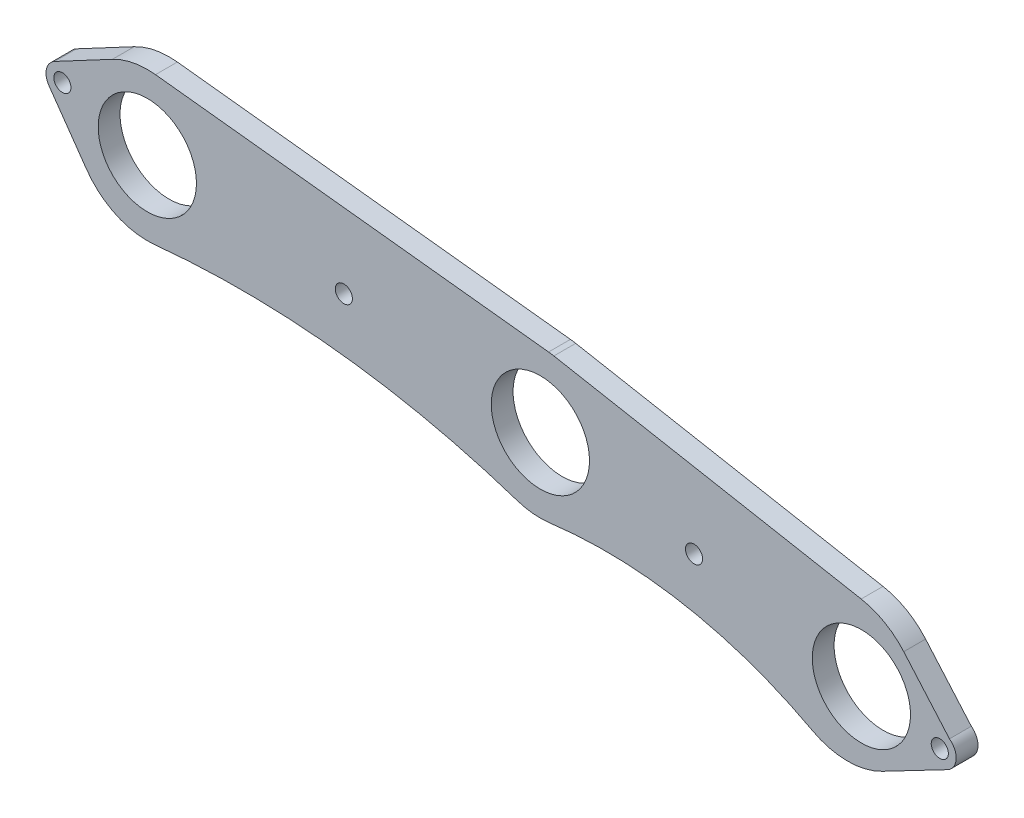
ISO-10303-21;
HEADER;
FILE_DESCRIPTION(('STEP AP214'),'2;1');
FILE_NAME('part.step','',(''),(''),'','','');
FILE_SCHEMA(('AUTOMOTIVE_DESIGN { 1 0 10303 214 1 1 1 1 }'));
ENDSEC;
DATA;
#1=APPLICATION_CONTEXT('core data for automotive mechanical design processes');
#2=APPLICATION_PROTOCOL_DEFINITION('international standard','automotive_design',2000,#1);
#3=PRODUCT_CONTEXT('',#1,'mechanical');
#4=PRODUCT('Part','Part','',(#3));
#5=PRODUCT_RELATED_PRODUCT_CATEGORY('part','',(#4));
#6=PRODUCT_DEFINITION_FORMATION('','',#4);
#7=PRODUCT_DEFINITION_CONTEXT('part definition',#1,'design');
#8=PRODUCT_DEFINITION('design','',#6,#7);
#9=PRODUCT_DEFINITION_SHAPE('','',#8);
#10=(LENGTH_UNIT() NAMED_UNIT(*) SI_UNIT(.MILLI.,.METRE.));
#11=(NAMED_UNIT(*) PLANE_ANGLE_UNIT() SI_UNIT($,.RADIAN.));
#12=(NAMED_UNIT(*) SI_UNIT($,.STERADIAN.) SOLID_ANGLE_UNIT());
#13=UNCERTAINTY_MEASURE_WITH_UNIT(LENGTH_MEASURE(1.E-05),#10,'distance_accuracy_value','');
#14=(GEOMETRIC_REPRESENTATION_CONTEXT(3) GLOBAL_UNCERTAINTY_ASSIGNED_CONTEXT((#13)) GLOBAL_UNIT_ASSIGNED_CONTEXT((#10,
#11,#12)) REPRESENTATION_CONTEXT('',''));
#15=CARTESIAN_POINT('',(0.,0.,0.));
#16=DIRECTION('',(0.,0.,1.));
#17=DIRECTION('',(1.,0.,0.));
#18=AXIS2_PLACEMENT_3D('',#15,#16,#17);
#19=CARTESIAN_POINT('',(-85.1036083337734,656.720348758841,6.35));
#20=DIRECTION('',(0.,0.,-1.));
#21=DIRECTION('',(-1.,0.,0.));
#22=AXIS2_PLACEMENT_3D('',#19,#20,#21);
#23=CYLINDRICAL_SURFACE('',#22,2.48919999905411);
#24=CARTESIAN_POINT('',(-85.1036083337734,656.720348758841,6.35));
#25=DIRECTION('',(0.,0.,1.));
#26=DIRECTION('',(1.,0.,0.));
#27=AXIS2_PLACEMENT_3D('',#24,#25,#26);
#28=CIRCLE('',#27,2.48919999905411);
#29=CARTESIAN_POINT('',(-82.6144083347193,656.720348758841,6.35));
#30=VERTEX_POINT('',#29);
#31=EDGE_CURVE('E257',#30,#30,#28,.T.);
#32=ORIENTED_EDGE('',*,*,#31,.T.);
#33=EDGE_LOOP('',(#32));
#34=FACE_BOUND('',#33,.T.);
#35=CARTESIAN_POINT('',(-85.1036083337734,656.720348758841,0.));
#36=DIRECTION('',(0.,0.,1.));
#37=DIRECTION('',(1.,0.,0.));
#38=AXIS2_PLACEMENT_3D('',#35,#36,#37);
#39=CIRCLE('',#38,2.48919999905411);
#40=CARTESIAN_POINT('',(-82.6144083347193,656.720348758841,0.));
#41=VERTEX_POINT('',#40);
#42=EDGE_CURVE('E312',#41,#41,#39,.T.);
#43=ORIENTED_EDGE('',*,*,#42,.F.);
#44=EDGE_LOOP('',(#43));
#45=FACE_BOUND('',#44,.T.);
#46=ADVANCED_FACE('F96',(#34,#45),#23,.F.);
#47=CARTESIAN_POINT('',(-156.572666389755,669.986535011072,6.35));
#48=DIRECTION('',(0.,0.,-1.));
#49=DIRECTION('',(-1.,0.,0.));
#50=AXIS2_PLACEMENT_3D('',#47,#48,#49);
#51=CYLINDRICAL_SURFACE('',#50,2.48919999999983);
#52=CARTESIAN_POINT('',(-156.572666389755,669.986535011072,6.35));
#53=DIRECTION('',(0.,0.,1.));
#54=DIRECTION('',(1.,0.,0.));
#55=AXIS2_PLACEMENT_3D('',#52,#53,#54);
#56=CIRCLE('',#55,2.48919999999983);
#57=CARTESIAN_POINT('',(-154.083466389755,669.986535011072,6.35));
#58=VERTEX_POINT('',#57);
#59=EDGE_CURVE('E254',#58,#58,#56,.T.);
#60=ORIENTED_EDGE('',*,*,#59,.T.);
#61=EDGE_LOOP('',(#60));
#62=FACE_BOUND('',#61,.T.);
#63=CARTESIAN_POINT('',(-156.572666389755,669.986535011072,0.));
#64=DIRECTION('',(0.,0.,1.));
#65=DIRECTION('',(1.,0.,0.));
#66=AXIS2_PLACEMENT_3D('',#63,#64,#65);
#67=CIRCLE('',#66,2.48919999999983);
#68=CARTESIAN_POINT('',(-154.083466389755,669.986535011072,0.));
#69=VERTEX_POINT('',#68);
#70=EDGE_CURVE('E309',#69,#69,#67,.T.);
#71=ORIENTED_EDGE('',*,*,#70,.F.);
#72=EDGE_LOOP('',(#71));
#73=FACE_BOUND('',#72,.T.);
#74=ADVANCED_FACE('F409',(#62,#73),#51,.F.);
#75=CARTESIAN_POINT('',(-340.259255690184,696.862696955199,6.35));
#76=DIRECTION('',(0.,0.,-1.));
#77=DIRECTION('',(-1.,0.,0.));
#78=AXIS2_PLACEMENT_3D('',#75,#76,#77);
#79=CYLINDRICAL_SURFACE('',#78,2.48919999999983);
#80=CARTESIAN_POINT('',(-340.259255690184,696.862696955199,6.35));
#81=DIRECTION('',(0.,0.,1.));
#82=DIRECTION('',(1.,0.,0.));
#83=AXIS2_PLACEMENT_3D('',#80,#81,#82);
#84=CIRCLE('',#83,2.48919999999983);
#85=CARTESIAN_POINT('',(-337.770055690185,696.862696955199,6.35));
#86=VERTEX_POINT('',#85);
#87=EDGE_CURVE('E251',#86,#86,#84,.T.);
#88=ORIENTED_EDGE('',*,*,#87,.T.);
#89=EDGE_LOOP('',(#88));
#90=FACE_BOUND('',#89,.T.);
#91=CARTESIAN_POINT('',(-340.259255690184,696.862696955199,0.));
#92=DIRECTION('',(0.,0.,1.));
#93=DIRECTION('',(1.,0.,0.));
#94=AXIS2_PLACEMENT_3D('',#91,#92,#93);
#95=CIRCLE('',#94,2.48919999999983);
#96=CARTESIAN_POINT('',(-337.770055690185,696.862696955199,0.));
#97=VERTEX_POINT('',#96);
#98=EDGE_CURVE('E306',#97,#97,#95,.T.);
#99=ORIENTED_EDGE('',*,*,#98,.F.);
#100=EDGE_LOOP('',(#99));
#101=FACE_BOUND('',#100,.T.);
#102=ADVANCED_FACE('F415',(#90,#101),#79,.F.);
#103=CARTESIAN_POINT('',(-201.257752693168,678.246976399902,6.35));
#104=DIRECTION('',(0.,0.,-1.));
#105=DIRECTION('',(-1.,0.,0.));
#106=AXIS2_PLACEMENT_3D('',#103,#104,#105);
#107=CYLINDRICAL_SURFACE('',#106,14.2875000000016);
#108=CARTESIAN_POINT('',(-201.257752693168,678.246976399902,6.35));
#109=DIRECTION('',(0.,0.,1.));
#110=DIRECTION('',(1.,0.,0.));
#111=AXIS2_PLACEMENT_3D('',#108,#109,#110);
#112=CIRCLE('',#111,14.2875000000016);
#113=CARTESIAN_POINT('',(-186.970252693166,678.246976399902,6.35));
#114=VERTEX_POINT('',#113);
#115=EDGE_CURVE('E248',#114,#114,#112,.T.);
#116=ORIENTED_EDGE('',*,*,#115,.T.);
#117=EDGE_LOOP('',(#116));
#118=FACE_BOUND('',#117,.T.);
#119=CARTESIAN_POINT('',(-201.257752693168,678.246976399902,0.));
#120=DIRECTION('',(0.,0.,1.));
#121=DIRECTION('',(1.,0.,0.));
#122=AXIS2_PLACEMENT_3D('',#119,#120,#121);
#123=CIRCLE('',#122,14.2875000000016);
#124=CARTESIAN_POINT('',(-186.970252693166,678.246976399902,0.));
#125=VERTEX_POINT('',#124);
#126=EDGE_CURVE('E303',#125,#125,#123,.T.);
#127=ORIENTED_EDGE('',*,*,#126,.F.);
#128=EDGE_LOOP('',(#127));
#129=FACE_BOUND('',#128,.T.);
#130=ADVANCED_FACE('F423',(#118,#129),#107,.F.);
#131=CARTESIAN_POINT('',(-315.557752693168,690.946976399902,6.35));
#132=DIRECTION('',(0.,0.,-1.));
#133=DIRECTION('',(-1.,0.,0.));
#134=AXIS2_PLACEMENT_3D('',#131,#132,#133);
#135=CYLINDRICAL_SURFACE('',#134,14.2875000000015);
#136=CARTESIAN_POINT('',(-315.557752693168,690.946976399902,6.35));
#137=DIRECTION('',(0.,0.,1.));
#138=DIRECTION('',(1.,0.,0.));
#139=AXIS2_PLACEMENT_3D('',#136,#137,#138);
#140=CIRCLE('',#139,14.2875000000015);
#141=CARTESIAN_POINT('',(-301.270252693166,690.946976399902,6.35));
#142=VERTEX_POINT('',#141);
#143=EDGE_CURVE('E245',#142,#142,#140,.T.);
#144=ORIENTED_EDGE('',*,*,#143,.T.);
#145=EDGE_LOOP('',(#144));
#146=FACE_BOUND('',#145,.T.);
#147=CARTESIAN_POINT('',(-315.557752693168,690.946976399902,0.));
#148=DIRECTION('',(0.,0.,1.));
#149=DIRECTION('',(1.,0.,0.));
#150=AXIS2_PLACEMENT_3D('',#147,#148,#149);
#151=CIRCLE('',#150,14.2875000000015);
#152=CARTESIAN_POINT('',(-301.270252693166,690.946976399902,0.));
#153=VERTEX_POINT('',#152);
#154=EDGE_CURVE('E300',#153,#153,#151,.T.);
#155=ORIENTED_EDGE('',*,*,#154,.F.);
#156=EDGE_LOOP('',(#155));
#157=FACE_BOUND('',#156,.T.);
#158=ADVANCED_FACE('F427',(#146,#157),#135,.F.);
#159=CARTESIAN_POINT('',(-258.407752693168,684.596976399902,6.35));
#160=DIRECTION('',(0.,0.,-1.));
#161=DIRECTION('',(-1.,0.,0.));
#162=AXIS2_PLACEMENT_3D('',#159,#160,#161);
#163=CYLINDRICAL_SURFACE('',#162,2.48919999999983);
#164=CARTESIAN_POINT('',(-258.407752693168,684.596976399902,6.35));
#165=DIRECTION('',(0.,0.,1.));
#166=DIRECTION('',(1.,0.,0.));
#167=AXIS2_PLACEMENT_3D('',#164,#165,#166);
#168=CIRCLE('',#167,2.48919999999983);
#169=CARTESIAN_POINT('',(-255.918552693168,684.596976399902,6.35));
#170=VERTEX_POINT('',#169);
#171=EDGE_CURVE('E237',#170,#170,#168,.T.);
#172=ORIENTED_EDGE('',*,*,#171,.T.);
#173=EDGE_LOOP('',(#172));
#174=FACE_BOUND('',#173,.T.);
#175=CARTESIAN_POINT('',(-258.407752693168,684.596976399902,0.));
#176=DIRECTION('',(0.,0.,1.));
#177=DIRECTION('',(1.,0.,0.));
#178=AXIS2_PLACEMENT_3D('',#175,#176,#177);
#179=CIRCLE('',#178,2.48919999999983);
#180=CARTESIAN_POINT('',(-255.918552693168,684.596976399902,0.));
#181=VERTEX_POINT('',#180);
#182=EDGE_CURVE('E297',#181,#181,#179,.T.);
#183=ORIENTED_EDGE('',*,*,#182,.F.);
#184=EDGE_LOOP('',(#183));
#185=FACE_BOUND('',#184,.T.);
#186=ADVANCED_FACE('F431',(#174,#185),#163,.F.);
#187=CARTESIAN_POINT('',(-340.259255690184,696.862696955199,6.35));
#188=DIRECTION('',(0.,0.,-1.));
#189=DIRECTION('',(-1.,0.,0.));
#190=AXIS2_PLACEMENT_3D('',#187,#188,#189);
#191=CYLINDRICAL_SURFACE('',#190,4.76250000000003);
#192=CARTESIAN_POINT('',(-340.259255690184,696.862696955199,0.));
#193=DIRECTION('',(0.,0.,1.));
#194=DIRECTION('',(1.,0.,0.));
#195=AXIS2_PLACEMENT_3D('',#192,#193,#194);
#196=CIRCLE('',#195,4.76250000000003);
#197=CARTESIAN_POINT('',(-342.496787835994,701.066844448624,0.));
#198=VERTEX_POINT('',#197);
#199=CARTESIAN_POINT('',(-344.158503195196,694.128236287232,0.));
#200=VERTEX_POINT('',#199);
#201=EDGE_CURVE('E263',#198,#200,#196,.T.);
#202=ORIENTED_EDGE('',*,*,#201,.T.);
#203=DIRECTION('',(0.,0.,-1.));
#204=VECTOR('',#203,1.);
#205=CARTESIAN_POINT('',(-344.158503195196,694.128236287232,6.35));
#206=LINE('',#205,#204);
#207=CARTESIAN_POINT('',(-344.158503195196,694.128236287232,6.35));
#208=VERTEX_POINT('',#207);
#209=EDGE_CURVE('E105',#208,#200,#206,.T.);
#210=ORIENTED_EDGE('',*,*,#209,.F.);
#211=CARTESIAN_POINT('',(-340.259255690184,696.862696955199,6.35));
#212=DIRECTION('',(0.,0.,1.));
#213=DIRECTION('',(1.,0.,0.));
#214=AXIS2_PLACEMENT_3D('',#211,#212,#213);
#215=CIRCLE('',#214,4.76250000000003);
#216=CARTESIAN_POINT('',(-342.496787835994,701.066844448624,6.35));
#217=VERTEX_POINT('',#216);
#218=EDGE_CURVE('E365',#217,#208,#215,.T.);
#219=ORIENTED_EDGE('',*,*,#218,.F.);
#220=DIRECTION('',(0.,0.,-1.));
#221=VECTOR('',#220,1.);
#222=CARTESIAN_POINT('',(-342.496787835994,701.066844448624,6.35));
#223=LINE('',#222,#221);
#224=EDGE_CURVE('E12',#217,#198,#223,.T.);
#225=ORIENTED_EDGE('',*,*,#224,.T.);
#226=EDGE_LOOP('',(#202,#210,#219,#225));
#227=FACE_BOUND('',#226,.T.);
#228=ADVANCED_FACE('F435',(#227),#191,.T.);
#229=CARTESIAN_POINT('',(95.6025165999803,67.0440440278248,6.35));
#230=DIRECTION('',(0.8187396335982,0.574164969652003,0.));
#231=DIRECTION('',(-0.574164969652003,0.8187396335982,0.));
#232=AXIS2_PLACEMENT_3D('',#229,#230,#231);
#233=PLANE('',#232);
#234=DIRECTION('',(0.574164969652003,-0.8187396335982,0.));
#235=VECTOR('',#234,1.);
#236=CARTESIAN_POINT('',(95.6025165999803,67.0440440278248,0.));
#237=LINE('',#236,#235);
#238=CARTESIAN_POINT('',(-333.234341382553,678.550754705115,0.));
#239=VERTEX_POINT('',#238);
#240=EDGE_CURVE('E266',#200,#239,#237,.T.);
#241=ORIENTED_EDGE('',*,*,#240,.T.);
#242=DIRECTION('',(0.,0.,-1.));
#243=VECTOR('',#242,1.);
#244=CARTESIAN_POINT('',(-333.234341382553,678.550754705115,6.35));
#245=LINE('',#244,#243);
#246=CARTESIAN_POINT('',(-333.234341382553,678.550754705115,6.35));
#247=VERTEX_POINT('',#246);
#248=EDGE_CURVE('E339',#247,#239,#245,.T.);
#249=ORIENTED_EDGE('',*,*,#248,.F.);
#250=DIRECTION('',(0.574164969652003,-0.8187396335982,0.));
#251=VECTOR('',#250,1.);
#252=CARTESIAN_POINT('',(95.6025165999803,67.0440440278248,6.35));
#253=LINE('',#252,#251);
#254=EDGE_CURVE('E348',#208,#247,#253,.T.);
#255=ORIENTED_EDGE('',*,*,#254,.F.);
#256=ORIENTED_EDGE('',*,*,#209,.T.);
#257=EDGE_LOOP('',(#241,#249,#255,#256));
#258=FACE_BOUND('',#257,.T.);
#259=ADVANCED_FACE('F346',(#258),#233,.F.);
#260=CARTESIAN_POINT('',(-315.557752693168,690.946976399902,6.35));
#261=DIRECTION('',(0.,0.,-1.));
#262=DIRECTION('',(-1.,0.,0.));
#263=AXIS2_PLACEMENT_3D('',#260,#261,#262);
#264=CYLINDRICAL_SURFACE('',#263,21.59);
#265=CARTESIAN_POINT('',(-315.557752693168,690.946976399902,0.));
#266=DIRECTION('',(0.,0.,1.));
#267=DIRECTION('',(1.,0.,0.));
#268=AXIS2_PLACEMENT_3D('',#265,#266,#267);
#269=CIRCLE('',#268,21.59);
#270=CARTESIAN_POINT('',(-313.412304982843,669.463839894208,0.));
#271=VERTEX_POINT('',#270);
#272=EDGE_CURVE('E268',#239,#271,#269,.T.);
#273=ORIENTED_EDGE('',*,*,#272,.T.);
#274=DIRECTION('',(0.,0.,-1.));
#275=VECTOR('',#274,1.);
#276=CARTESIAN_POINT('',(-313.412304982843,669.463839894208,6.35));
#277=LINE('',#276,#275);
#278=CARTESIAN_POINT('',(-313.412304982843,669.463839894208,6.35));
#279=VERTEX_POINT('',#278);
#280=EDGE_CURVE('E337',#279,#271,#277,.T.);
#281=ORIENTED_EDGE('',*,*,#280,.F.);
#282=CARTESIAN_POINT('',(-315.557752693168,690.946976399902,6.35));
#283=DIRECTION('',(0.,0.,1.));
#284=DIRECTION('',(1.,0.,0.));
#285=AXIS2_PLACEMENT_3D('',#282,#283,#284);
#286=CIRCLE('',#285,21.59);
#287=EDGE_CURVE('E239',#247,#279,#286,.T.);
#288=ORIENTED_EDGE('',*,*,#287,.F.);
#289=ORIENTED_EDGE('',*,*,#248,.T.);
#290=EDGE_LOOP('',(#273,#281,#288,#289));
#291=FACE_BOUND('',#290,.T.);
#292=ADVANCED_FACE('F359',(#291),#264,.T.);
#293=CARTESIAN_POINT('',(-288.171743684904,416.721057474284,6.35));
#294=DIRECTION('',(0.,0.,-1.));
#295=DIRECTION('',(-1.,0.,0.));
#296=AXIS2_PLACEMENT_3D('',#293,#294,#295);
#297=CYLINDRICAL_SURFACE('',#296,254.);
#298=CARTESIAN_POINT('',(-288.171743684904,416.721057474284,0.));
#299=DIRECTION('',(0.,0.,1.));
#300=DIRECTION('',(1.,0.,0.));
#301=AXIS2_PLACEMENT_3D('',#298,#299,#300);
#302=CIRCLE('',#301,254.);
#303=CARTESIAN_POINT('',(-208.066682863027,657.758770769784,0.));
#304=VERTEX_POINT('',#303);
#305=EDGE_CURVE('E271',#304,#271,#302,.T.);
#306=ORIENTED_EDGE('',*,*,#305,.F.);
#307=DIRECTION('',(0.,0.,-1.));
#308=VECTOR('',#307,1.);
#309=CARTESIAN_POINT('',(-208.066682863027,657.758770769784,6.35));
#310=LINE('',#309,#308);
#311=CARTESIAN_POINT('',(-208.066682863027,657.758770769784,6.35));
#312=VERTEX_POINT('',#311);
#313=EDGE_CURVE('E335',#312,#304,#310,.T.);
#314=ORIENTED_EDGE('',*,*,#313,.F.);
#315=CARTESIAN_POINT('',(-288.171743684904,416.721057474284,6.35));
#316=DIRECTION('',(0.,0.,1.));
#317=DIRECTION('',(1.,0.,0.));
#318=AXIS2_PLACEMENT_3D('',#315,#316,#317);
#319=CIRCLE('',#318,254.);
#320=EDGE_CURVE('E363',#312,#279,#319,.T.);
#321=ORIENTED_EDGE('',*,*,#320,.T.);
#322=ORIENTED_EDGE('',*,*,#280,.T.);
#323=EDGE_LOOP('',(#306,#314,#321,#322));
#324=FACE_BOUND('',#323,.T.);
#325=ADVANCED_FACE('F467',(#324),#297,.F.);
#326=CARTESIAN_POINT('',(-201.257752693168,678.246976399902,6.35));
#327=DIRECTION('',(0.,0.,-1.));
#328=DIRECTION('',(-1.,0.,0.));
#329=AXIS2_PLACEMENT_3D('',#326,#327,#328);
#330=CYLINDRICAL_SURFACE('',#329,21.59);
#331=CARTESIAN_POINT('',(-201.257752693168,678.246976399902,0.));
#332=DIRECTION('',(0.,0.,1.));
#333=DIRECTION('',(1.,0.,0.));
#334=AXIS2_PLACEMENT_3D('',#331,#332,#333);
#335=CIRCLE('',#334,21.59);
#336=CARTESIAN_POINT('',(-198.501625842426,656.833619241749,0.));
#337=VERTEX_POINT('',#336);
#338=EDGE_CURVE('E275',#304,#337,#335,.T.);
#339=ORIENTED_EDGE('',*,*,#338,.T.);
#340=DIRECTION('',(0.,0.,-1.));
#341=VECTOR('',#340,1.);
#342=CARTESIAN_POINT('',(-198.501625842426,656.833619241749,6.35));
#343=LINE('',#342,#341);
#344=CARTESIAN_POINT('',(-198.501625842426,656.833619241749,6.35));
#345=VERTEX_POINT('',#344);
#346=EDGE_CURVE('E333',#345,#337,#343,.T.);
#347=ORIENTED_EDGE('',*,*,#346,.F.);
#348=CARTESIAN_POINT('',(-201.257752693168,678.246976399902,6.35));
#349=DIRECTION('',(0.,0.,1.));
#350=DIRECTION('',(1.,0.,0.));
#351=AXIS2_PLACEMENT_3D('',#348,#349,#350);
#352=CIRCLE('',#351,21.59);
#353=EDGE_CURVE('E224',#312,#345,#352,.T.);
#354=ORIENTED_EDGE('',*,*,#353,.F.);
#355=ORIENTED_EDGE('',*,*,#313,.T.);
#356=EDGE_LOOP('',(#339,#347,#354,#355));
#357=FACE_BOUND('',#356,.T.);
#358=ADVANCED_FACE('F443',(#357),#330,.T.);
#359=CARTESIAN_POINT('',(-182.289114955711,530.872694782025,6.35));
#360=DIRECTION('',(0.,0.,-1.));
#361=DIRECTION('',(-1.,0.,0.));
#362=AXIS2_PLACEMENT_3D('',#359,#360,#361);
#363=CYLINDRICAL_SURFACE('',#362,127.);
#364=CARTESIAN_POINT('',(-182.289114955711,530.872694782025,0.));
#365=DIRECTION('',(0.,0.,1.));
#366=DIRECTION('',(1.,0.,0.));
#367=AXIS2_PLACEMENT_3D('',#364,#365,#366);
#368=CIRCLE('',#367,127.);
#369=CARTESIAN_POINT('',(-122.116862930609,642.713206611271,0.));
#370=VERTEX_POINT('',#369);
#371=EDGE_CURVE('E278',#370,#337,#368,.T.);
#372=ORIENTED_EDGE('',*,*,#371,.F.);
#373=DIRECTION('',(0.,0.,-1.));
#374=VECTOR('',#373,1.);
#375=CARTESIAN_POINT('',(-122.116862930609,642.713206611271,6.35));
#376=LINE('',#375,#374);
#377=CARTESIAN_POINT('',(-122.116862930609,642.713206611271,6.35));
#378=VERTEX_POINT('',#377);
#379=EDGE_CURVE('E331',#378,#370,#376,.T.);
#380=ORIENTED_EDGE('',*,*,#379,.F.);
#381=CARTESIAN_POINT('',(-182.289114955711,530.872694782025,6.35));
#382=DIRECTION('',(0.,0.,1.));
#383=DIRECTION('',(1.,0.,0.));
#384=AXIS2_PLACEMENT_3D('',#381,#382,#383);
#385=CIRCLE('',#384,127.);
#386=EDGE_CURVE('E369',#378,#345,#385,.T.);
#387=ORIENTED_EDGE('',*,*,#386,.T.);
#388=ORIENTED_EDGE('',*,*,#346,.T.);
#389=EDGE_LOOP('',(#372,#380,#387,#388));
#390=FACE_BOUND('',#389,.T.);
#391=ADVANCED_FACE('F463',(#390),#363,.F.);
#392=CARTESIAN_POINT('',(-111.887580086342,661.726093622243,6.35));
#393=DIRECTION('',(0.,0.,-1.));
#394=DIRECTION('',(-1.,0.,0.));
#395=AXIS2_PLACEMENT_3D('',#392,#393,#394);
#396=CYLINDRICAL_SURFACE('',#395,21.59);
#397=CARTESIAN_POINT('',(-111.887580086342,661.726093622243,0.));
#398=DIRECTION('',(0.,0.,1.));
#399=DIRECTION('',(1.,0.,0.));
#400=AXIS2_PLACEMENT_3D('',#397,#398,#399);
#401=CIRCLE('',#400,21.59);
#402=CARTESIAN_POINT('',(-101.900666029164,642.584786257944,0.));
#403=VERTEX_POINT('',#402);
#404=EDGE_CURVE('E281',#370,#403,#401,.T.);
#405=ORIENTED_EDGE('',*,*,#404,.T.);
#406=DIRECTION('',(0.,0.,-1.));
#407=VECTOR('',#406,1.);
#408=CARTESIAN_POINT('',(-101.900666029164,642.584786257944,6.35));
#409=LINE('',#408,#407);
#410=CARTESIAN_POINT('',(-101.900666029164,642.584786257944,6.35));
#411=VERTEX_POINT('',#410);
#412=EDGE_CURVE('E329',#411,#403,#409,.T.);
#413=ORIENTED_EDGE('',*,*,#412,.F.);
#414=CARTESIAN_POINT('',(-111.887580086342,661.726093622243,6.35));
#415=DIRECTION('',(0.,0.,1.));
#416=DIRECTION('',(1.,0.,0.));
#417=AXIS2_PLACEMENT_3D('',#414,#415,#416);
#418=CIRCLE('',#417,21.59);
#419=EDGE_CURVE('E372',#378,#411,#418,.T.);
#420=ORIENTED_EDGE('',*,*,#419,.F.);
#421=ORIENTED_EDGE('',*,*,#379,.T.);
#422=EDGE_LOOP('',(#405,#413,#420,#421));
#423=FACE_BOUND('',#422,.T.);
#424=ADVANCED_FACE('F451',(#423),#396,.T.);
#425=CARTESIAN_POINT('',(-285.332696706559,546.879728560287,6.35));
#426=DIRECTION('',(0.462571285649741,-0.886582091908215,0.));
#427=DIRECTION('',(0.886582091908215,0.462571285649741,0.));
#428=AXIS2_PLACEMENT_3D('',#425,#426,#427);
#429=PLANE('',#428);
#430=DIRECTION('',(-0.886582091908215,-0.462571285649741,0.));
#431=VECTOR('',#430,1.);
#432=CARTESIAN_POINT('',(-285.332696706559,546.879728560287,0.));
#433=LINE('',#432,#431);
#434=CARTESIAN_POINT('',(-82.9006125863039,652.498001546966,0.));
#435=VERTEX_POINT('',#434);
#436=EDGE_CURVE('E284',#435,#403,#433,.T.);
#437=ORIENTED_EDGE('',*,*,#436,.F.);
#438=DIRECTION('',(0.,0.,-1.));
#439=VECTOR('',#438,1.);
#440=CARTESIAN_POINT('',(-82.9006125863039,652.498001546966,6.35));
#441=LINE('',#440,#439);
#442=CARTESIAN_POINT('',(-82.9006125863039,652.498001546966,6.35));
#443=VERTEX_POINT('',#442);
#444=EDGE_CURVE('E327',#443,#435,#441,.T.);
#445=ORIENTED_EDGE('',*,*,#444,.F.);
#446=DIRECTION('',(-0.886582091908215,-0.462571285649741,0.));
#447=VECTOR('',#446,1.);
#448=CARTESIAN_POINT('',(-285.332696706559,546.879728560287,6.35));
#449=LINE('',#448,#447);
#450=EDGE_CURVE('E374',#443,#411,#449,.T.);
#451=ORIENTED_EDGE('',*,*,#450,.T.);
#452=ORIENTED_EDGE('',*,*,#412,.T.);
#453=EDGE_LOOP('',(#437,#445,#451,#452));
#454=FACE_BOUND('',#453,.T.);
#455=ADVANCED_FACE('F458',(#454),#429,.T.);
#456=CARTESIAN_POINT('',(-85.1036083337734,656.720348758841,6.35));
#457=DIRECTION('',(0.,0.,-1.));
#458=DIRECTION('',(-1.,0.,0.));
#459=AXIS2_PLACEMENT_3D('',#456,#457,#458);
#460=CYLINDRICAL_SURFACE('',#459,4.76249999905428);
#461=CARTESIAN_POINT('',(-85.1036083337734,656.720348758841,0.));
#462=DIRECTION('',(0.,0.,1.));
#463=DIRECTION('',(1.,0.,0.));
#464=AXIS2_PLACEMENT_3D('',#461,#462,#463);
#465=CIRCLE('',#464,4.76249999905428);
#466=CARTESIAN_POINT('',(-82.2851956048184,660.559353308233,0.));
#467=VERTEX_POINT('',#466);
#468=EDGE_CURVE('E288',#435,#467,#465,.T.);
#469=ORIENTED_EDGE('',*,*,#468,.T.);
#470=DIRECTION('',(0.,0.,-1.));
#471=VECTOR('',#470,1.);
#472=CARTESIAN_POINT('',(-82.2851956048184,660.559353308233,6.35));
#473=LINE('',#472,#471);
#474=CARTESIAN_POINT('',(-82.2851956048184,660.559353308233,6.35));
#475=VERTEX_POINT('',#474);
#476=EDGE_CURVE('E324',#475,#467,#473,.T.);
#477=ORIENTED_EDGE('',*,*,#476,.F.);
#478=CARTESIAN_POINT('',(-85.1036083337734,656.720348758841,6.35));
#479=DIRECTION('',(0.,0.,1.));
#480=DIRECTION('',(1.,0.,0.));
#481=AXIS2_PLACEMENT_3D('',#478,#479,#480);
#482=CIRCLE('',#481,4.76249999905428);
#483=EDGE_CURVE('E378',#443,#475,#482,.T.);
#484=ORIENTED_EDGE('',*,*,#483,.F.);
#485=ORIENTED_EDGE('',*,*,#444,.T.);
#486=EDGE_LOOP('',(#469,#477,#484,#485));
#487=FACE_BOUND('',#486,.T.);
#488=ADVANCED_FACE('F454',(#487),#460,.T.);
#489=CARTESIAN_POINT('',(280.074812806132,243.120320950769,6.35));
#490=DIRECTION('',(-0.755169981371391,-0.655529022420467,0.));
#491=DIRECTION('',(0.655529022420467,-0.755169981371391,0.));
#492=AXIS2_PLACEMENT_3D('',#489,#490,#491);
#493=PLANE('',#492);
#494=DIRECTION('',(-0.655529022420467,0.755169981371391,0.));
#495=VECTOR('',#494,1.);
#496=CARTESIAN_POINT('',(280.074812806132,243.120320950769,0.));
#497=LINE('',#496,#495);
#498=CARTESIAN_POINT('',(-95.5834601885337,675.878965216301,0.));
#499=VERTEX_POINT('',#498);
#500=EDGE_CURVE('E290',#467,#499,#497,.T.);
#501=ORIENTED_EDGE('',*,*,#500,.T.);
#502=DIRECTION('',(0.,0.,-1.));
#503=VECTOR('',#502,1.);
#504=CARTESIAN_POINT('',(-95.5834601885337,675.878965216301,6.35));
#505=LINE('',#504,#503);
#506=CARTESIAN_POINT('',(-95.5834601885337,675.878965216301,6.35));
#507=VERTEX_POINT('',#506);
#508=EDGE_CURVE('E321',#507,#499,#505,.T.);
#509=ORIENTED_EDGE('',*,*,#508,.F.);
#510=DIRECTION('',(-0.655529022420467,0.755169981371391,0.));
#511=VECTOR('',#510,1.);
#512=CARTESIAN_POINT('',(280.074812806132,243.120320950769,6.35));
#513=LINE('',#512,#511);
#514=EDGE_CURVE('E379',#475,#507,#513,.T.);
#515=ORIENTED_EDGE('',*,*,#514,.F.);
#516=ORIENTED_EDGE('',*,*,#476,.T.);
#517=EDGE_LOOP('',(#501,#509,#515,#516));
#518=FACE_BOUND('',#517,.T.);
#519=ADVANCED_FACE('F449',(#518),#493,.F.);
#520=CARTESIAN_POINT('',(-107.962968085422,682.956390856201,0.));
#521=VERTEX_POINT('',#520);
#522=EDGE_CURVE('E285',#499,#521,#401,.T.);
#523=ORIENTED_EDGE('',*,*,#522,.T.);
#524=DIRECTION('',(0.,0.,-1.));
#525=VECTOR('',#524,1.);
#526=CARTESIAN_POINT('',(-107.962968085422,682.956390856201,6.35));
#527=LINE('',#526,#525);
#528=CARTESIAN_POINT('',(-107.962968085422,682.956390856201,6.35));
#529=VERTEX_POINT('',#528);
#530=EDGE_CURVE('E319',#529,#521,#527,.T.);
#531=ORIENTED_EDGE('',*,*,#530,.F.);
#532=EDGE_CURVE('E375',#507,#529,#418,.T.);
#533=ORIENTED_EDGE('',*,*,#532,.F.);
#534=ORIENTED_EDGE('',*,*,#508,.T.);
#535=EDGE_LOOP('',(#523,#531,#533,#534));
#536=FACE_BOUND('',#535,.T.);
#537=ADVANCED_FACE('F446',(#536),#396,.T.);
#538=CARTESIAN_POINT('',(118.511375392094,641.09056502637,6.35));
#539=DIRECTION('',(0.181779157059774,0.983339380915174,0.));
#540=DIRECTION('',(-0.983339380915174,0.181779157059774,0.));
#541=AXIS2_PLACEMENT_3D('',#538,#539,#540);
#542=PLANE('',#541);
#543=DIRECTION('',(0.983339380915174,-0.181779157059774,0.));
#544=VECTOR('',#543,1.);
#545=CARTESIAN_POINT('',(118.511375392094,641.09056502637,0.));
#546=LINE('',#545,#544);
#547=CARTESIAN_POINT('',(-197.333140692247,699.47727363386,0.));
#548=VERTEX_POINT('',#547);
#549=EDGE_CURVE('E292',#548,#521,#546,.T.);
#550=ORIENTED_EDGE('',*,*,#549,.F.);
#551=DIRECTION('',(0.,0.,-1.));
#552=VECTOR('',#551,1.);
#553=CARTESIAN_POINT('',(-197.333140692247,699.47727363386,6.35));
#554=LINE('',#553,#552);
#555=CARTESIAN_POINT('',(-197.333140692247,699.47727363386,6.35));
#556=VERTEX_POINT('',#555);
#557=EDGE_CURVE('E233',#556,#548,#554,.T.);
#558=ORIENTED_EDGE('',*,*,#557,.F.);
#559=DIRECTION('',(0.983339380915174,-0.181779157059774,0.));
#560=VECTOR('',#559,1.);
#561=CARTESIAN_POINT('',(118.511375392094,641.09056502637,6.35));
#562=LINE('',#561,#560);
#563=EDGE_CURVE('E221',#556,#529,#562,.T.);
#564=ORIENTED_EDGE('',*,*,#563,.T.);
#565=ORIENTED_EDGE('',*,*,#530,.T.);
#566=EDGE_LOOP('',(#550,#558,#564,#565));
#567=FACE_BOUND('',#566,.T.);
#568=ADVANCED_FACE('F386',(#567),#542,.T.);
#569=CARTESIAN_POINT('',(-198.873536045212,699.704926231505,0.));
#570=VERTEX_POINT('',#569);
#571=EDGE_CURVE('E229',#548,#570,#335,.T.);
#572=ORIENTED_EDGE('',*,*,#571,.T.);
#573=DIRECTION('',(0.,0.,-1.));
#574=VECTOR('',#573,1.);
#575=CARTESIAN_POINT('',(-198.873536045212,699.704926231505,6.35));
#576=LINE('',#575,#574);
#577=CARTESIAN_POINT('',(-198.873536045212,699.704926231505,6.35));
#578=VERTEX_POINT('',#577);
#579=EDGE_CURVE('E226',#578,#570,#576,.T.);
#580=ORIENTED_EDGE('',*,*,#579,.F.);
#581=EDGE_CURVE('E214',#556,#578,#352,.T.);
#582=ORIENTED_EDGE('',*,*,#581,.F.);
#583=ORIENTED_EDGE('',*,*,#557,.T.);
#584=EDGE_LOOP('',(#572,#580,#582,#583));
#585=FACE_BOUND('',#584,.T.);
#586=ADVANCED_FACE('F227',(#585),#330,.T.);
#587=CARTESIAN_POINT('',(74.3715951224196,669.344356101768,6.35));
#588=DIRECTION('',(0.110431526074848,0.993883734673619,0.));
#589=DIRECTION('',(-0.993883734673619,0.110431526074848,0.));
#590=AXIS2_PLACEMENT_3D('',#587,#588,#589);
#591=PLANE('',#590);
#592=DIRECTION('',(0.993883734673619,-0.110431526074848,0.));
#593=VECTOR('',#592,1.);
#594=CARTESIAN_POINT('',(74.3715951224196,669.344356101768,0.));
#595=LINE('',#594,#593);
#596=CARTESIAN_POINT('',(-313.173536045212,712.404926231505,0.));
#597=VERTEX_POINT('',#596);
#598=EDGE_CURVE('E295',#597,#570,#595,.T.);
#599=ORIENTED_EDGE('',*,*,#598,.F.);
#600=DIRECTION('',(0.,0.,-1.));
#601=VECTOR('',#600,1.);
#602=CARTESIAN_POINT('',(-313.173536045212,712.404926231505,6.35));
#603=LINE('',#602,#601);
#604=CARTESIAN_POINT('',(-313.173536045212,712.404926231505,6.35));
#605=VERTEX_POINT('',#604);
#606=EDGE_CURVE('E164',#605,#597,#603,.T.);
#607=ORIENTED_EDGE('',*,*,#606,.F.);
#608=DIRECTION('',(0.993883734673619,-0.110431526074848,0.));
#609=VECTOR('',#608,1.);
#610=CARTESIAN_POINT('',(74.3715951224196,669.344356101768,6.35));
#611=LINE('',#610,#609);
#612=EDGE_CURVE('E219',#605,#578,#611,.T.);
#613=ORIENTED_EDGE('',*,*,#612,.T.);
#614=ORIENTED_EDGE('',*,*,#579,.T.);
#615=EDGE_LOOP('',(#599,#607,#613,#614));
#616=FACE_BOUND('',#615,.T.);
#617=ADVANCED_FACE('F235',(#616),#591,.T.);
#618=CARTESIAN_POINT('',(-325.701231754173,710.005778370092,0.));
#619=VERTEX_POINT('',#618);
#620=EDGE_CURVE('E272',#597,#619,#269,.T.);
#621=ORIENTED_EDGE('',*,*,#620,.T.);
#622=DIRECTION('',(0.,0.,-1.));
#623=VECTOR('',#622,1.);
#624=CARTESIAN_POINT('',(-325.701231754173,710.005778370092,6.35));
#625=LINE('',#624,#623);
#626=CARTESIAN_POINT('',(-325.701231754173,710.005778370092,6.35));
#627=VERTEX_POINT('',#626);
#628=EDGE_CURVE('E171',#627,#619,#625,.T.);
#629=ORIENTED_EDGE('',*,*,#628,.F.);
#630=EDGE_CURVE('E113',#605,#627,#286,.T.);
#631=ORIENTED_EDGE('',*,*,#630,.F.);
#632=ORIENTED_EDGE('',*,*,#606,.T.);
#633=EDGE_LOOP('',(#621,#629,#631,#632));
#634=FACE_BOUND('',#633,.T.);
#635=ADVANCED_FACE('F389',(#634),#264,.T.);
#636=CARTESIAN_POINT('',(-366.361925085833,688.365336748383,6.35));
#637=DIRECTION('',(-0.469823022742238,0.882760628540573,0.));
#638=DIRECTION('',(-0.882760628540573,-0.469823022742238,0.));
#639=AXIS2_PLACEMENT_3D('',#636,#637,#638);
#640=PLANE('',#639);
#641=DIRECTION('',(0.882760628540573,0.469823022742238,0.));
#642=VECTOR('',#641,1.);
#643=CARTESIAN_POINT('',(-366.361925085833,688.365336748383,0.));
#644=LINE('',#643,#642);
#645=EDGE_CURVE('E260',#198,#619,#644,.T.);
#646=ORIENTED_EDGE('',*,*,#645,.F.);
#647=ORIENTED_EDGE('',*,*,#224,.F.);
#648=DIRECTION('',(0.882760628540573,0.469823022742238,0.));
#649=VECTOR('',#648,1.);
#650=CARTESIAN_POINT('',(-366.361925085833,688.365336748383,6.35));
#651=LINE('',#650,#649);
#652=EDGE_CURVE('E315',#217,#627,#651,.T.);
#653=ORIENTED_EDGE('',*,*,#652,.T.);
#654=ORIENTED_EDGE('',*,*,#628,.T.);
#655=EDGE_LOOP('',(#646,#647,#653,#654));
#656=FACE_BOUND('',#655,.T.);
#657=ADVANCED_FACE('F98',(#656),#640,.T.);
#658=CARTESIAN_POINT('',(0.,0.,0.));
#659=DIRECTION('',(0.,0.,1.));
#660=DIRECTION('',(1.,0.,0.));
#661=AXIS2_PLACEMENT_3D('',#658,#659,#660);
#662=PLANE('',#661);
#663=CARTESIAN_POINT('',(-107.902955313159,660.989499780354,0.));
#664=DIRECTION('',(0.,0.,1.));
#665=DIRECTION('',(1.,0.,0.));
#666=AXIS2_PLACEMENT_3D('',#663,#664,#665);
#667=CIRCLE('',#666,14.2874999999998);
#668=CARTESIAN_POINT('',(-93.6154553131588,660.989499780354,0.));
#669=VERTEX_POINT('',#668);
#670=EDGE_CURVE('E394',#669,#669,#667,.T.);
#671=ORIENTED_EDGE('',*,*,#670,.T.);
#672=EDGE_LOOP('',(#671));
#673=FACE_BOUND('',#672,.T.);
#674=ORIENTED_EDGE('',*,*,#645,.T.);
#675=ORIENTED_EDGE('',*,*,#620,.F.);
#676=ORIENTED_EDGE('',*,*,#598,.T.);
#677=ORIENTED_EDGE('',*,*,#571,.F.);
#678=ORIENTED_EDGE('',*,*,#549,.T.);
#679=ORIENTED_EDGE('',*,*,#522,.F.);
#680=ORIENTED_EDGE('',*,*,#500,.F.);
#681=ORIENTED_EDGE('',*,*,#468,.F.);
#682=ORIENTED_EDGE('',*,*,#436,.T.);
#683=ORIENTED_EDGE('',*,*,#404,.F.);
#684=ORIENTED_EDGE('',*,*,#371,.T.);
#685=ORIENTED_EDGE('',*,*,#338,.F.);
#686=ORIENTED_EDGE('',*,*,#305,.T.);
#687=ORIENTED_EDGE('',*,*,#272,.F.);
#688=ORIENTED_EDGE('',*,*,#240,.F.);
#689=ORIENTED_EDGE('',*,*,#201,.F.);
#690=EDGE_LOOP('',(#674,#675,#676,#677,#678,#679,#680,#681,#682,#683,#684,#685,#686,#687,#688,#689));
#691=FACE_BOUND('',#690,.T.);
#692=ORIENTED_EDGE('',*,*,#182,.T.);
#693=EDGE_LOOP('',(#692));
#694=FACE_BOUND('',#693,.T.);
#695=ORIENTED_EDGE('',*,*,#154,.T.);
#696=EDGE_LOOP('',(#695));
#697=FACE_BOUND('',#696,.T.);
#698=ORIENTED_EDGE('',*,*,#126,.T.);
#699=EDGE_LOOP('',(#698));
#700=FACE_BOUND('',#699,.T.);
#701=ORIENTED_EDGE('',*,*,#98,.T.);
#702=EDGE_LOOP('',(#701));
#703=FACE_BOUND('',#702,.T.);
#704=ORIENTED_EDGE('',*,*,#70,.T.);
#705=EDGE_LOOP('',(#704));
#706=FACE_BOUND('',#705,.T.);
#707=ORIENTED_EDGE('',*,*,#42,.T.);
#708=EDGE_LOOP('',(#707));
#709=FACE_BOUND('',#708,.T.);
#710=ADVANCED_FACE('F353',(#673,#691,#694,#697,#700,#703,#706,#709),#662,.F.);
#711=CARTESIAN_POINT('',(0.,0.,6.35));
#712=DIRECTION('',(0.,0.,1.));
#713=DIRECTION('',(1.,0.,0.));
#714=AXIS2_PLACEMENT_3D('',#711,#712,#713);
#715=PLANE('',#714);
#716=CARTESIAN_POINT('',(-107.902955313159,660.989499780354,6.35));
#717=DIRECTION('',(0.,0.,1.));
#718=DIRECTION('',(1.,0.,0.));
#719=AXIS2_PLACEMENT_3D('',#716,#717,#718);
#720=CIRCLE('',#719,14.2874999999998);
#721=CARTESIAN_POINT('',(-93.6154553131588,660.989499780354,6.35));
#722=VERTEX_POINT('',#721);
#723=EDGE_CURVE('E264',#722,#722,#720,.T.);
#724=ORIENTED_EDGE('',*,*,#723,.F.);
#725=EDGE_LOOP('',(#724));
#726=FACE_BOUND('',#725,.T.);
#727=ORIENTED_EDGE('',*,*,#652,.F.);
#728=ORIENTED_EDGE('',*,*,#218,.T.);
#729=ORIENTED_EDGE('',*,*,#254,.T.);
#730=ORIENTED_EDGE('',*,*,#287,.T.);
#731=ORIENTED_EDGE('',*,*,#320,.F.);
#732=ORIENTED_EDGE('',*,*,#353,.T.);
#733=ORIENTED_EDGE('',*,*,#386,.F.);
#734=ORIENTED_EDGE('',*,*,#419,.T.);
#735=ORIENTED_EDGE('',*,*,#450,.F.);
#736=ORIENTED_EDGE('',*,*,#483,.T.);
#737=ORIENTED_EDGE('',*,*,#514,.T.);
#738=ORIENTED_EDGE('',*,*,#532,.T.);
#739=ORIENTED_EDGE('',*,*,#563,.F.);
#740=ORIENTED_EDGE('',*,*,#581,.T.);
#741=ORIENTED_EDGE('',*,*,#612,.F.);
#742=ORIENTED_EDGE('',*,*,#630,.T.);
#743=EDGE_LOOP('',(#727,#728,#729,#730,#731,#732,#733,#734,#735,#736,#737,#738,#739,#740,#741,#742));
#744=FACE_BOUND('',#743,.T.);
#745=ORIENTED_EDGE('',*,*,#171,.F.);
#746=EDGE_LOOP('',(#745));
#747=FACE_BOUND('',#746,.T.);
#748=ORIENTED_EDGE('',*,*,#143,.F.);
#749=EDGE_LOOP('',(#748));
#750=FACE_BOUND('',#749,.T.);
#751=ORIENTED_EDGE('',*,*,#115,.F.);
#752=EDGE_LOOP('',(#751));
#753=FACE_BOUND('',#752,.T.);
#754=ORIENTED_EDGE('',*,*,#87,.F.);
#755=EDGE_LOOP('',(#754));
#756=FACE_BOUND('',#755,.T.);
#757=ORIENTED_EDGE('',*,*,#59,.F.);
#758=EDGE_LOOP('',(#757));
#759=FACE_BOUND('',#758,.T.);
#760=ORIENTED_EDGE('',*,*,#31,.F.);
#761=EDGE_LOOP('',(#760));
#762=FACE_BOUND('',#761,.T.);
#763=ADVANCED_FACE('F216',(#726,#744,#747,#750,#753,#756,#759,#762),#715,.T.);
#764=CARTESIAN_POINT('',(-107.902955313159,660.989499780354,6.351));
#765=DIRECTION('',(0.,0.,-1.));
#766=DIRECTION('',(-1.,0.,0.));
#767=AXIS2_PLACEMENT_3D('',#764,#765,#766);
#768=CYLINDRICAL_SURFACE('',#767,14.2874999999998);
#769=ORIENTED_EDGE('',*,*,#723,.T.);
#770=EDGE_LOOP('',(#769));
#771=FACE_BOUND('',#770,.T.);
#772=ORIENTED_EDGE('',*,*,#670,.F.);
#773=EDGE_LOOP('',(#772));
#774=FACE_BOUND('',#773,.T.);
#775=ADVANCED_FACE('F399',(#771,#774),#768,.F.);
#776=CLOSED_SHELL('',(#46,#74,#102,#130,#158,#186,#228,#259,#292,#325,#358,#391,#424,#455,#488,
#519,#537,#568,#586,#617,#635,#657,#710,#763,#775));
#777=MANIFOLD_SOLID_BREP('B2',#776);
#778=ADVANCED_BREP_SHAPE_REPRESENTATION('',(#18,#777),#14);
#779=SHAPE_DEFINITION_REPRESENTATION(#9,#778);
ENDSEC;
END-ISO-10303-21;
